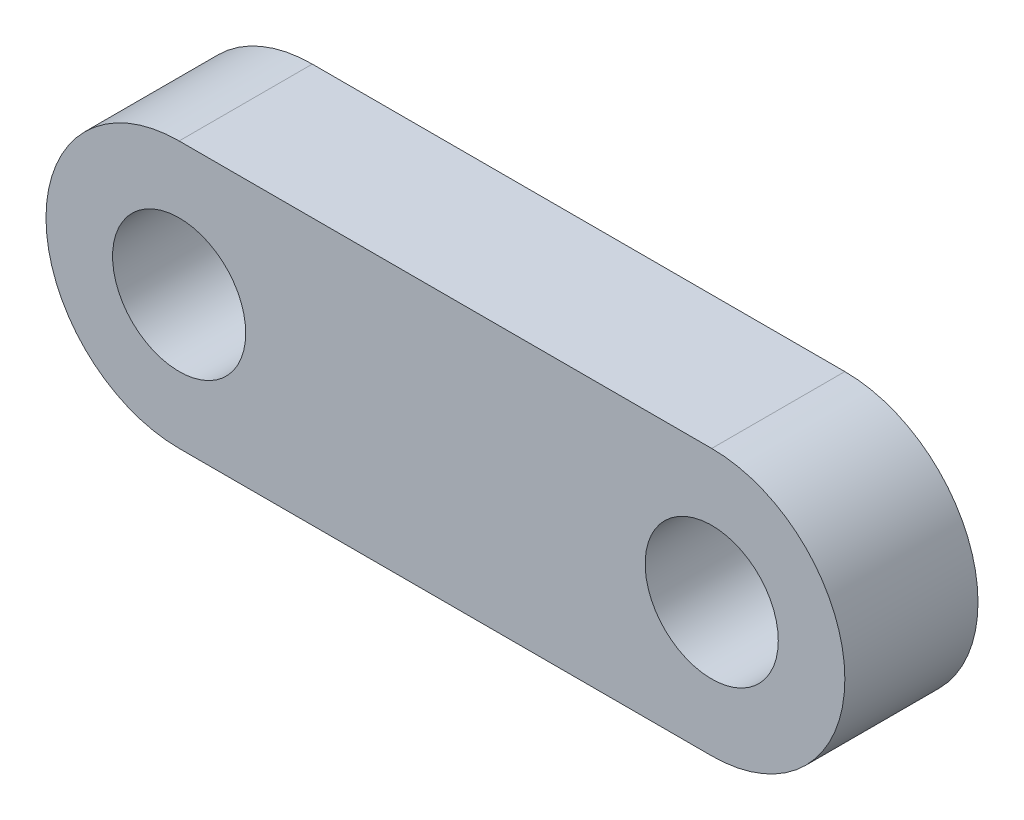
ISO-10303-21;
HEADER;
FILE_DESCRIPTION(('STEP AP214'),'2;1');
FILE_NAME('part.step','',(''),(''),'','','');
FILE_SCHEMA(('AUTOMOTIVE_DESIGN { 1 0 10303 214 1 1 1 1 }'));
ENDSEC;
DATA;
#1=APPLICATION_CONTEXT('core data for automotive mechanical design processes');
#2=APPLICATION_PROTOCOL_DEFINITION('international standard','automotive_design',2000,#1);
#3=PRODUCT_CONTEXT('',#1,'mechanical');
#4=PRODUCT('Part','Part','',(#3));
#5=PRODUCT_RELATED_PRODUCT_CATEGORY('part','',(#4));
#6=PRODUCT_DEFINITION_FORMATION('','',#4);
#7=PRODUCT_DEFINITION_CONTEXT('part definition',#1,'design');
#8=PRODUCT_DEFINITION('design','',#6,#7);
#9=PRODUCT_DEFINITION_SHAPE('','',#8);
#10=(LENGTH_UNIT() NAMED_UNIT(*) SI_UNIT(.MILLI.,.METRE.));
#11=(NAMED_UNIT(*) PLANE_ANGLE_UNIT() SI_UNIT($,.RADIAN.));
#12=(NAMED_UNIT(*) SI_UNIT($,.STERADIAN.) SOLID_ANGLE_UNIT());
#13=UNCERTAINTY_MEASURE_WITH_UNIT(LENGTH_MEASURE(1.E-05),#10,'distance_accuracy_value','');
#14=(GEOMETRIC_REPRESENTATION_CONTEXT(3) GLOBAL_UNCERTAINTY_ASSIGNED_CONTEXT((#13)) GLOBAL_UNIT_ASSIGNED_CONTEXT((#10,
#11,#12)) REPRESENTATION_CONTEXT('',''));
#15=CARTESIAN_POINT('',(0.,0.,0.));
#16=DIRECTION('',(0.,0.,1.));
#17=DIRECTION('',(1.,0.,0.));
#18=AXIS2_PLACEMENT_3D('',#15,#16,#17);
#19=CARTESIAN_POINT('',(-40.,25.,-5.));
#20=DIRECTION('',(0.,0.,1.));
#21=DIRECTION('',(1.,0.,0.));
#22=AXIS2_PLACEMENT_3D('',#19,#20,#21);
#23=CYLINDRICAL_SURFACE('',#22,5.);
#24=CARTESIAN_POINT('',(-40.,25.,0.));
#25=DIRECTION('',(0.,0.,1.));
#26=DIRECTION('',(1.,0.,0.));
#27=AXIS2_PLACEMENT_3D('',#24,#25,#26);
#28=CIRCLE('',#27,5.);
#29=CARTESIAN_POINT('',(-40.,20.,0.));
#30=VERTEX_POINT('',#29);
#31=CARTESIAN_POINT('',(-40.,30.,0.));
#32=VERTEX_POINT('',#31);
#33=EDGE_CURVE('E97',#30,#32,#28,.T.);
#34=ORIENTED_EDGE('',*,*,#33,.F.);
#35=DIRECTION('',(0.,0.,1.));
#36=VECTOR('',#35,1.);
#37=CARTESIAN_POINT('',(-40.,20.,-5.));
#38=LINE('',#37,#36);
#39=CARTESIAN_POINT('',(-40.,20.,-5.));
#40=VERTEX_POINT('',#39);
#41=EDGE_CURVE('E11',#40,#30,#38,.T.);
#42=ORIENTED_EDGE('',*,*,#41,.F.);
#43=CARTESIAN_POINT('',(-40.,25.,-5.));
#44=DIRECTION('',(0.,0.,1.));
#45=DIRECTION('',(1.,0.,0.));
#46=AXIS2_PLACEMENT_3D('',#43,#44,#45);
#47=CIRCLE('',#46,5.);
#48=CARTESIAN_POINT('',(-40.,30.,-5.));
#49=VERTEX_POINT('',#48);
#50=EDGE_CURVE('E90',#40,#49,#47,.T.);
#51=ORIENTED_EDGE('',*,*,#50,.T.);
#52=DIRECTION('',(0.,0.,1.));
#53=VECTOR('',#52,1.);
#54=CARTESIAN_POINT('',(-40.,30.,-5.));
#55=LINE('',#54,#53);
#56=EDGE_CURVE('E35',#49,#32,#55,.T.);
#57=ORIENTED_EDGE('',*,*,#56,.T.);
#58=EDGE_LOOP('',(#34,#42,#51,#57));
#59=FACE_BOUND('',#58,.T.);
#60=ADVANCED_FACE('F32',(#59),#23,.T.);
#61=CARTESIAN_POINT('',(-40.,20.,-5.));
#62=DIRECTION('',(0.,-1.,0.));
#63=DIRECTION('',(0.,0.,-1.));
#64=AXIS2_PLACEMENT_3D('',#61,#62,#63);
#65=PLANE('',#64);
#66=DIRECTION('',(1.,0.,0.));
#67=VECTOR('',#66,1.);
#68=CARTESIAN_POINT('',(-40.,20.,0.));
#69=LINE('',#68,#67);
#70=CARTESIAN_POINT('',(-60.,20.,0.));
#71=VERTEX_POINT('',#70);
#72=EDGE_CURVE('E92',#71,#30,#69,.T.);
#73=ORIENTED_EDGE('',*,*,#72,.F.);
#74=DIRECTION('',(0.,0.,1.));
#75=VECTOR('',#74,1.);
#76=CARTESIAN_POINT('',(-60.,20.,-5.));
#77=LINE('',#76,#75);
#78=CARTESIAN_POINT('',(-60.,20.,-5.));
#79=VERTEX_POINT('',#78);
#80=EDGE_CURVE('E41',#79,#71,#77,.T.);
#81=ORIENTED_EDGE('',*,*,#80,.F.);
#82=DIRECTION('',(1.,0.,0.));
#83=VECTOR('',#82,1.);
#84=CARTESIAN_POINT('',(-40.,20.,-5.));
#85=LINE('',#84,#83);
#86=EDGE_CURVE('E87',#79,#40,#85,.T.);
#87=ORIENTED_EDGE('',*,*,#86,.T.);
#88=ORIENTED_EDGE('',*,*,#41,.T.);
#89=EDGE_LOOP('',(#73,#81,#87,#88));
#90=FACE_BOUND('',#89,.T.);
#91=ADVANCED_FACE('F108',(#90),#65,.T.);
#92=CARTESIAN_POINT('',(-60.,25.,-5.));
#93=DIRECTION('',(0.,0.,1.));
#94=DIRECTION('',(1.,0.,0.));
#95=AXIS2_PLACEMENT_3D('',#92,#93,#94);
#96=CYLINDRICAL_SURFACE('',#95,5.);
#97=CARTESIAN_POINT('',(-60.,25.,0.));
#98=DIRECTION('',(0.,0.,1.));
#99=DIRECTION('',(1.,0.,0.));
#100=AXIS2_PLACEMENT_3D('',#97,#98,#99);
#101=CIRCLE('',#100,5.);
#102=CARTESIAN_POINT('',(-60.,30.,0.));
#103=VERTEX_POINT('',#102);
#104=EDGE_CURVE('E82',#103,#71,#101,.T.);
#105=ORIENTED_EDGE('',*,*,#104,.F.);
#106=DIRECTION('',(0.,0.,1.));
#107=VECTOR('',#106,1.);
#108=CARTESIAN_POINT('',(-60.,30.,-5.));
#109=LINE('',#108,#107);
#110=CARTESIAN_POINT('',(-60.,30.,-5.));
#111=VERTEX_POINT('',#110);
#112=EDGE_CURVE('E77',#111,#103,#109,.T.);
#113=ORIENTED_EDGE('',*,*,#112,.F.);
#114=CARTESIAN_POINT('',(-60.,25.,-5.));
#115=DIRECTION('',(0.,0.,1.));
#116=DIRECTION('',(1.,0.,0.));
#117=AXIS2_PLACEMENT_3D('',#114,#115,#116);
#118=CIRCLE('',#117,5.);
#119=EDGE_CURVE('E80',#111,#79,#118,.T.);
#120=ORIENTED_EDGE('',*,*,#119,.T.);
#121=ORIENTED_EDGE('',*,*,#80,.T.);
#122=EDGE_LOOP('',(#105,#113,#120,#121));
#123=FACE_BOUND('',#122,.T.);
#124=ADVANCED_FACE('F79',(#123),#96,.T.);
#125=CARTESIAN_POINT('',(-40.,30.,-5.));
#126=DIRECTION('',(0.,1.,0.));
#127=DIRECTION('',(-1.,0.,0.));
#128=AXIS2_PLACEMENT_3D('',#125,#126,#127);
#129=PLANE('',#128);
#130=DIRECTION('',(-1.,0.,0.));
#131=VECTOR('',#130,1.);
#132=CARTESIAN_POINT('',(-40.,30.,0.));
#133=LINE('',#132,#131);
#134=EDGE_CURVE('E100',#32,#103,#133,.T.);
#135=ORIENTED_EDGE('',*,*,#134,.F.);
#136=ORIENTED_EDGE('',*,*,#56,.F.);
#137=DIRECTION('',(-1.,0.,0.));
#138=VECTOR('',#137,1.);
#139=CARTESIAN_POINT('',(-40.,30.,-5.));
#140=LINE('',#139,#138);
#141=EDGE_CURVE('E86',#49,#111,#140,.T.);
#142=ORIENTED_EDGE('',*,*,#141,.T.);
#143=ORIENTED_EDGE('',*,*,#112,.T.);
#144=EDGE_LOOP('',(#135,#136,#142,#143));
#145=FACE_BOUND('',#144,.T.);
#146=ADVANCED_FACE('F89',(#145),#129,.T.);
#147=CARTESIAN_POINT('',(-40.,25.,-5.));
#148=DIRECTION('',(0.,0.,1.));
#149=DIRECTION('',(1.,0.,0.));
#150=AXIS2_PLACEMENT_3D('',#147,#148,#149);
#151=PLANE('',#150);
#152=CARTESIAN_POINT('',(-60.,25.,-5.));
#153=DIRECTION('',(0.,0.,1.));
#154=DIRECTION('',(1.,0.,0.));
#155=AXIS2_PLACEMENT_3D('',#152,#153,#154);
#156=CIRCLE('',#155,2.5);
#157=CARTESIAN_POINT('',(-57.5,25.,-5.));
#158=VERTEX_POINT('',#157);
#159=EDGE_CURVE('E141',#158,#158,#156,.T.);
#160=ORIENTED_EDGE('',*,*,#159,.T.);
#161=EDGE_LOOP('',(#160));
#162=FACE_BOUND('',#161,.T.);
#163=CARTESIAN_POINT('',(-40.,25.,-5.));
#164=DIRECTION('',(0.,0.,1.));
#165=DIRECTION('',(1.,0.,0.));
#166=AXIS2_PLACEMENT_3D('',#163,#164,#165);
#167=CIRCLE('',#166,2.5);
#168=CARTESIAN_POINT('',(-37.5,25.,-5.));
#169=VERTEX_POINT('',#168);
#170=EDGE_CURVE('E101',#169,#169,#167,.T.);
#171=ORIENTED_EDGE('',*,*,#170,.T.);
#172=EDGE_LOOP('',(#171));
#173=FACE_BOUND('',#172,.T.);
#174=ORIENTED_EDGE('',*,*,#50,.F.);
#175=ORIENTED_EDGE('',*,*,#86,.F.);
#176=ORIENTED_EDGE('',*,*,#119,.F.);
#177=ORIENTED_EDGE('',*,*,#141,.F.);
#178=EDGE_LOOP('',(#174,#175,#176,#177));
#179=FACE_BOUND('',#178,.T.);
#180=ADVANCED_FACE('F85',(#162,#173,#179),#151,.F.);
#181=CARTESIAN_POINT('',(-40.,25.,0.));
#182=DIRECTION('',(0.,0.,1.));
#183=DIRECTION('',(1.,0.,0.));
#184=AXIS2_PLACEMENT_3D('',#181,#182,#183);
#185=PLANE('',#184);
#186=CARTESIAN_POINT('',(-60.,25.,0.));
#187=DIRECTION('',(0.,0.,1.));
#188=DIRECTION('',(1.,0.,0.));
#189=AXIS2_PLACEMENT_3D('',#186,#187,#188);
#190=CIRCLE('',#189,2.5);
#191=CARTESIAN_POINT('',(-57.5,25.,0.));
#192=VERTEX_POINT('',#191);
#193=EDGE_CURVE('E144',#192,#192,#190,.T.);
#194=ORIENTED_EDGE('',*,*,#193,.F.);
#195=EDGE_LOOP('',(#194));
#196=FACE_BOUND('',#195,.T.);
#197=CARTESIAN_POINT('',(-40.,25.,0.));
#198=DIRECTION('',(0.,0.,1.));
#199=DIRECTION('',(1.,0.,0.));
#200=AXIS2_PLACEMENT_3D('',#197,#198,#199);
#201=CIRCLE('',#200,2.5);
#202=CARTESIAN_POINT('',(-37.5,25.,0.));
#203=VERTEX_POINT('',#202);
#204=EDGE_CURVE('E146',#203,#203,#201,.T.);
#205=ORIENTED_EDGE('',*,*,#204,.F.);
#206=EDGE_LOOP('',(#205));
#207=FACE_BOUND('',#206,.T.);
#208=ORIENTED_EDGE('',*,*,#33,.T.);
#209=ORIENTED_EDGE('',*,*,#134,.T.);
#210=ORIENTED_EDGE('',*,*,#104,.T.);
#211=ORIENTED_EDGE('',*,*,#72,.T.);
#212=EDGE_LOOP('',(#208,#209,#210,#211));
#213=FACE_BOUND('',#212,.T.);
#214=ADVANCED_FACE('F107',(#196,#207,#213),#185,.T.);
#215=CARTESIAN_POINT('',(-40.,25.,-5.));
#216=DIRECTION('',(0.,0.,1.));
#217=DIRECTION('',(1.,0.,0.));
#218=AXIS2_PLACEMENT_3D('',#215,#216,#217);
#219=CYLINDRICAL_SURFACE('',#218,2.5);
#220=ORIENTED_EDGE('',*,*,#170,.F.);
#221=EDGE_LOOP('',(#220));
#222=FACE_BOUND('',#221,.T.);
#223=ORIENTED_EDGE('',*,*,#204,.T.);
#224=EDGE_LOOP('',(#223));
#225=FACE_BOUND('',#224,.T.);
#226=ADVANCED_FACE('F126',(#222,#225),#219,.F.);
#227=CARTESIAN_POINT('',(-60.,25.,-5.));
#228=DIRECTION('',(0.,0.,1.));
#229=DIRECTION('',(1.,0.,0.));
#230=AXIS2_PLACEMENT_3D('',#227,#228,#229);
#231=CYLINDRICAL_SURFACE('',#230,2.5);
#232=ORIENTED_EDGE('',*,*,#159,.F.);
#233=EDGE_LOOP('',(#232));
#234=FACE_BOUND('',#233,.T.);
#235=ORIENTED_EDGE('',*,*,#193,.T.);
#236=EDGE_LOOP('',(#235));
#237=FACE_BOUND('',#236,.T.);
#238=ADVANCED_FACE('F133',(#234,#237),#231,.F.);
#239=CLOSED_SHELL('',(#60,#91,#124,#146,#180,#214,#226,#238));
#240=MANIFOLD_SOLID_BREP('B2',#239);
#241=ADVANCED_BREP_SHAPE_REPRESENTATION('',(#18,#240),#14);
#242=SHAPE_DEFINITION_REPRESENTATION(#9,#241);
ENDSEC;
END-ISO-10303-21;
